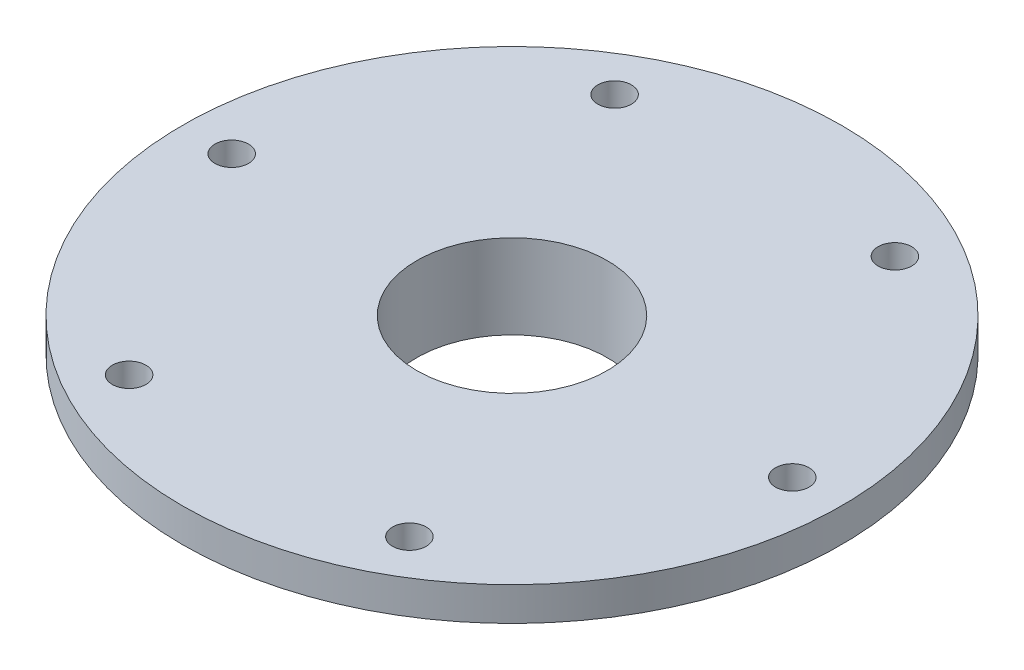
ISO-10303-21;
HEADER;
FILE_DESCRIPTION(('STEP AP214'),'2;1');
FILE_NAME('part.step','',(''),(''),'','','');
FILE_SCHEMA(('AUTOMOTIVE_DESIGN { 1 0 10303 214 1 1 1 1 }'));
ENDSEC;
DATA;
#1=APPLICATION_CONTEXT('core data for automotive mechanical design processes');
#2=APPLICATION_PROTOCOL_DEFINITION('international standard','automotive_design',2000,#1);
#3=PRODUCT_CONTEXT('',#1,'mechanical');
#4=PRODUCT('Part','Part','',(#3));
#5=PRODUCT_RELATED_PRODUCT_CATEGORY('part','',(#4));
#6=PRODUCT_DEFINITION_FORMATION('','',#4);
#7=PRODUCT_DEFINITION_CONTEXT('part definition',#1,'design');
#8=PRODUCT_DEFINITION('design','',#6,#7);
#9=PRODUCT_DEFINITION_SHAPE('','',#8);
#10=(LENGTH_UNIT() NAMED_UNIT(*) SI_UNIT(.MILLI.,.METRE.));
#11=(NAMED_UNIT(*) PLANE_ANGLE_UNIT() SI_UNIT($,.RADIAN.));
#12=(NAMED_UNIT(*) SI_UNIT($,.STERADIAN.) SOLID_ANGLE_UNIT());
#13=UNCERTAINTY_MEASURE_WITH_UNIT(LENGTH_MEASURE(1.E-05),#10,'distance_accuracy_value','');
#14=(GEOMETRIC_REPRESENTATION_CONTEXT(3) GLOBAL_UNCERTAINTY_ASSIGNED_CONTEXT((#13)) GLOBAL_UNIT_ASSIGNED_CONTEXT((#10,
#11,#12)) REPRESENTATION_CONTEXT('',''));
#15=CARTESIAN_POINT('',(0.,0.,0.));
#16=DIRECTION('',(0.,0.,1.));
#17=DIRECTION('',(1.,0.,0.));
#18=AXIS2_PLACEMENT_3D('',#15,#16,#17);
#19=CARTESIAN_POINT('',(0.,27.2792430533376,0.));
#20=DIRECTION('',(0.,1.,0.));
#21=DIRECTION('',(0.,0.,1.));
#22=AXIS2_PLACEMENT_3D('',#19,#20,#21);
#23=CYLINDRICAL_SURFACE('',#22,8.5);
#24=CARTESIAN_POINT('',(0.,0.,0.));
#25=DIRECTION('',(0.,1.,0.));
#26=DIRECTION('',(0.,0.,1.));
#27=AXIS2_PLACEMENT_3D('',#24,#25,#26);
#28=CIRCLE('',#27,8.5);
#29=CARTESIAN_POINT('',(0.,0.,8.5));
#30=VERTEX_POINT('',#29);
#31=EDGE_CURVE('E10',#30,#30,#28,.T.);
#32=ORIENTED_EDGE('',*,*,#31,.T.);
#33=EDGE_LOOP('',(#32));
#34=FACE_BOUND('',#33,.T.);
#35=CARTESIAN_POINT('',(0.,-7.5,0.));
#36=DIRECTION('',(0.,1.,0.));
#37=DIRECTION('',(0.,0.,1.));
#38=AXIS2_PLACEMENT_3D('',#35,#36,#37);
#39=CIRCLE('',#38,8.49999999999999);
#40=CARTESIAN_POINT('',(0.,-7.5,8.49999999999999));
#41=VERTEX_POINT('',#40);
#42=EDGE_CURVE('E70',#41,#41,#39,.T.);
#43=ORIENTED_EDGE('',*,*,#42,.F.);
#44=EDGE_LOOP('',(#43));
#45=FACE_BOUND('',#44,.T.);
#46=ADVANCED_FACE('F37',(#34,#45),#23,.F.);
#47=CARTESIAN_POINT('',(-8.5,0.,0.));
#48=DIRECTION('',(0.,1.,0.));
#49=DIRECTION('',(0.,0.,1.));
#50=AXIS2_PLACEMENT_3D('',#47,#48,#49);
#51=PLANE('',#50);
#52=CARTESIAN_POINT('',(-25.,0.,0.));
#53=DIRECTION('',(0.,1.,0.));
#54=DIRECTION('',(0.,0.,1.));
#55=AXIS2_PLACEMENT_3D('',#52,#53,#54);
#56=CIRCLE('',#55,1.5);
#57=CARTESIAN_POINT('',(-25.,0.,1.5));
#58=VERTEX_POINT('',#57);
#59=EDGE_CURVE('E57',#58,#58,#56,.T.);
#60=ORIENTED_EDGE('',*,*,#59,.F.);
#61=EDGE_LOOP('',(#60));
#62=FACE_BOUND('',#61,.T.);
#63=CARTESIAN_POINT('',(-12.5,0.,21.650635094611));
#64=DIRECTION('',(0.,1.,0.));
#65=DIRECTION('',(0.,0.,1.));
#66=AXIS2_PLACEMENT_3D('',#63,#64,#65);
#67=CIRCLE('',#66,1.5);
#68=CARTESIAN_POINT('',(-12.5,0.,23.150635094611));
#69=VERTEX_POINT('',#68);
#70=EDGE_CURVE('E121',#69,#69,#67,.T.);
#71=ORIENTED_EDGE('',*,*,#70,.F.);
#72=EDGE_LOOP('',(#71));
#73=FACE_BOUND('',#72,.T.);
#74=CARTESIAN_POINT('',(12.5,0.,21.650635094611));
#75=DIRECTION('',(0.,1.,0.));
#76=DIRECTION('',(0.,0.,1.));
#77=AXIS2_PLACEMENT_3D('',#74,#75,#76);
#78=CIRCLE('',#77,1.5);
#79=CARTESIAN_POINT('',(12.5,0.,23.150635094611));
#80=VERTEX_POINT('',#79);
#81=EDGE_CURVE('E82',#80,#80,#78,.T.);
#82=ORIENTED_EDGE('',*,*,#81,.F.);
#83=EDGE_LOOP('',(#82));
#84=FACE_BOUND('',#83,.T.);
#85=CARTESIAN_POINT('',(25.,0.,0.));
#86=DIRECTION('',(0.,1.,0.));
#87=DIRECTION('',(0.,0.,1.));
#88=AXIS2_PLACEMENT_3D('',#85,#86,#87);
#89=CIRCLE('',#88,1.5);
#90=CARTESIAN_POINT('',(25.,0.,1.5));
#91=VERTEX_POINT('',#90);
#92=EDGE_CURVE('E128',#91,#91,#89,.T.);
#93=ORIENTED_EDGE('',*,*,#92,.F.);
#94=EDGE_LOOP('',(#93));
#95=FACE_BOUND('',#94,.T.);
#96=CARTESIAN_POINT('',(12.5,0.,-21.650635094611));
#97=DIRECTION('',(0.,1.,0.));
#98=DIRECTION('',(0.,0.,1.));
#99=AXIS2_PLACEMENT_3D('',#96,#97,#98);
#100=CIRCLE('',#99,1.5);
#101=CARTESIAN_POINT('',(12.5,0.,-20.150635094611));
#102=VERTEX_POINT('',#101);
#103=EDGE_CURVE('E132',#102,#102,#100,.T.);
#104=ORIENTED_EDGE('',*,*,#103,.F.);
#105=EDGE_LOOP('',(#104));
#106=FACE_BOUND('',#105,.T.);
#107=CARTESIAN_POINT('',(-12.5,0.,-21.650635094611));
#108=DIRECTION('',(0.,1.,0.));
#109=DIRECTION('',(0.,0.,1.));
#110=AXIS2_PLACEMENT_3D('',#107,#108,#109);
#111=CIRCLE('',#110,1.5);
#112=CARTESIAN_POINT('',(-12.5,0.,-20.150635094611));
#113=VERTEX_POINT('',#112);
#114=EDGE_CURVE('E136',#113,#113,#111,.T.);
#115=ORIENTED_EDGE('',*,*,#114,.F.);
#116=EDGE_LOOP('',(#115));
#117=FACE_BOUND('',#116,.T.);
#118=CARTESIAN_POINT('',(0.,0.,0.));
#119=DIRECTION('',(0.,1.,0.));
#120=DIRECTION('',(0.,0.,1.));
#121=AXIS2_PLACEMENT_3D('',#118,#119,#120);
#122=CIRCLE('',#121,29.39375);
#123=CARTESIAN_POINT('',(0.,0.,29.39375));
#124=VERTEX_POINT('',#123);
#125=EDGE_CURVE('E44',#124,#124,#122,.T.);
#126=ORIENTED_EDGE('',*,*,#125,.T.);
#127=EDGE_LOOP('',(#126));
#128=FACE_BOUND('',#127,.T.);
#129=ORIENTED_EDGE('',*,*,#31,.F.);
#130=EDGE_LOOP('',(#129));
#131=FACE_BOUND('',#130,.T.);
#132=ADVANCED_FACE('F104',(#62,#73,#84,#95,#106,#117,#128,#131),#51,.T.);
#133=CARTESIAN_POINT('',(0.,27.2792430533376,0.));
#134=DIRECTION('',(0.,1.,0.));
#135=DIRECTION('',(0.,0.,1.));
#136=AXIS2_PLACEMENT_3D('',#133,#134,#135);
#137=CYLINDRICAL_SURFACE('',#136,29.39375);
#138=CARTESIAN_POINT('',(0.,-3.,0.));
#139=DIRECTION('',(0.,1.,0.));
#140=DIRECTION('',(0.,0.,1.));
#141=AXIS2_PLACEMENT_3D('',#138,#139,#140);
#142=CIRCLE('',#141,29.39375);
#143=CARTESIAN_POINT('',(0.,-3.,29.39375));
#144=VERTEX_POINT('',#143);
#145=EDGE_CURVE('E49',#144,#144,#142,.T.);
#146=ORIENTED_EDGE('',*,*,#145,.T.);
#147=EDGE_LOOP('',(#146));
#148=FACE_BOUND('',#147,.T.);
#149=ORIENTED_EDGE('',*,*,#125,.F.);
#150=EDGE_LOOP('',(#149));
#151=FACE_BOUND('',#150,.T.);
#152=ADVANCED_FACE('F89',(#148,#151),#137,.T.);
#153=CARTESIAN_POINT('',(-29.39375,-3.,0.));
#154=DIRECTION('',(0.,-1.,0.));
#155=DIRECTION('',(0.,0.,-1.));
#156=AXIS2_PLACEMENT_3D('',#153,#154,#155);
#157=PLANE('',#156);
#158=CARTESIAN_POINT('',(-25.,-3.,0.));
#159=DIRECTION('',(0.,-1.,0.));
#160=DIRECTION('',(0.,0.,-1.));
#161=AXIS2_PLACEMENT_3D('',#158,#159,#160);
#162=CIRCLE('',#161,1.5);
#163=CARTESIAN_POINT('',(-25.,-3.,-1.5));
#164=VERTEX_POINT('',#163);
#165=EDGE_CURVE('E40',#164,#164,#162,.T.);
#166=ORIENTED_EDGE('',*,*,#165,.F.);
#167=EDGE_LOOP('',(#166));
#168=FACE_BOUND('',#167,.T.);
#169=CARTESIAN_POINT('',(-12.5,-3.,21.650635094611));
#170=DIRECTION('',(0.,-1.,0.));
#171=DIRECTION('',(0.,0.,-1.));
#172=AXIS2_PLACEMENT_3D('',#169,#170,#171);
#173=CIRCLE('',#172,1.5);
#174=CARTESIAN_POINT('',(-12.5,-3.,20.150635094611));
#175=VERTEX_POINT('',#174);
#176=EDGE_CURVE('E65',#175,#175,#173,.T.);
#177=ORIENTED_EDGE('',*,*,#176,.F.);
#178=EDGE_LOOP('',(#177));
#179=FACE_BOUND('',#178,.T.);
#180=CARTESIAN_POINT('',(12.5,-3.,21.650635094611));
#181=DIRECTION('',(0.,-1.,0.));
#182=DIRECTION('',(0.,0.,-1.));
#183=AXIS2_PLACEMENT_3D('',#180,#181,#182);
#184=CIRCLE('',#183,1.5);
#185=CARTESIAN_POINT('',(12.5,-3.,20.150635094611));
#186=VERTEX_POINT('',#185);
#187=EDGE_CURVE('E63',#186,#186,#184,.T.);
#188=ORIENTED_EDGE('',*,*,#187,.F.);
#189=EDGE_LOOP('',(#188));
#190=FACE_BOUND('',#189,.T.);
#191=CARTESIAN_POINT('',(25.,-3.,0.));
#192=DIRECTION('',(0.,-1.,0.));
#193=DIRECTION('',(0.,0.,-1.));
#194=AXIS2_PLACEMENT_3D('',#191,#192,#193);
#195=CIRCLE('',#194,1.5);
#196=CARTESIAN_POINT('',(25.,-3.,-1.5));
#197=VERTEX_POINT('',#196);
#198=EDGE_CURVE('E60',#197,#197,#195,.T.);
#199=ORIENTED_EDGE('',*,*,#198,.F.);
#200=EDGE_LOOP('',(#199));
#201=FACE_BOUND('',#200,.T.);
#202=CARTESIAN_POINT('',(12.5,-3.,-21.650635094611));
#203=DIRECTION('',(0.,-1.,0.));
#204=DIRECTION('',(0.,0.,-1.));
#205=AXIS2_PLACEMENT_3D('',#202,#203,#204);
#206=CIRCLE('',#205,1.5);
#207=CARTESIAN_POINT('',(12.5,-3.,-23.150635094611));
#208=VERTEX_POINT('',#207);
#209=EDGE_CURVE('E56',#208,#208,#206,.T.);
#210=ORIENTED_EDGE('',*,*,#209,.F.);
#211=EDGE_LOOP('',(#210));
#212=FACE_BOUND('',#211,.T.);
#213=CARTESIAN_POINT('',(-12.5,-3.,-21.650635094611));
#214=DIRECTION('',(0.,-1.,0.));
#215=DIRECTION('',(0.,0.,-1.));
#216=AXIS2_PLACEMENT_3D('',#213,#214,#215);
#217=CIRCLE('',#216,1.5);
#218=CARTESIAN_POINT('',(-12.5,-3.,-23.150635094611));
#219=VERTEX_POINT('',#218);
#220=EDGE_CURVE('E53',#219,#219,#217,.T.);
#221=ORIENTED_EDGE('',*,*,#220,.F.);
#222=EDGE_LOOP('',(#221));
#223=FACE_BOUND('',#222,.T.);
#224=CARTESIAN_POINT('',(0.,-3.,0.));
#225=DIRECTION('',(0.,1.,0.));
#226=DIRECTION('',(0.,0.,1.));
#227=AXIS2_PLACEMENT_3D('',#224,#225,#226);
#228=CIRCLE('',#227,11.75);
#229=CARTESIAN_POINT('',(0.,-3.,11.75));
#230=VERTEX_POINT('',#229);
#231=EDGE_CURVE('E79',#230,#230,#228,.T.);
#232=ORIENTED_EDGE('',*,*,#231,.T.);
#233=EDGE_LOOP('',(#232));
#234=FACE_BOUND('',#233,.T.);
#235=ORIENTED_EDGE('',*,*,#145,.F.);
#236=EDGE_LOOP('',(#235));
#237=FACE_BOUND('',#236,.T.);
#238=ADVANCED_FACE('F92',(#168,#179,#190,#201,#212,#223,#234,#237),#157,.T.);
#239=CARTESIAN_POINT('',(0.,27.2792430533376,0.));
#240=DIRECTION('',(0.,1.,0.));
#241=DIRECTION('',(0.,0.,1.));
#242=AXIS2_PLACEMENT_3D('',#239,#240,#241);
#243=CYLINDRICAL_SURFACE('',#242,11.75);
#244=CARTESIAN_POINT('',(0.,-7.5,0.));
#245=DIRECTION('',(0.,1.,0.));
#246=DIRECTION('',(0.,0.,1.));
#247=AXIS2_PLACEMENT_3D('',#244,#245,#246);
#248=CIRCLE('',#247,11.75);
#249=CARTESIAN_POINT('',(0.,-7.5,11.75));
#250=VERTEX_POINT('',#249);
#251=EDGE_CURVE('E74',#250,#250,#248,.T.);
#252=ORIENTED_EDGE('',*,*,#251,.T.);
#253=EDGE_LOOP('',(#252));
#254=FACE_BOUND('',#253,.T.);
#255=ORIENTED_EDGE('',*,*,#231,.F.);
#256=EDGE_LOOP('',(#255));
#257=FACE_BOUND('',#256,.T.);
#258=ADVANCED_FACE('F94',(#254,#257),#243,.T.);
#259=CARTESIAN_POINT('',(-11.75,-7.5,0.));
#260=DIRECTION('',(0.,-1.,0.));
#261=DIRECTION('',(0.,0.,-1.));
#262=AXIS2_PLACEMENT_3D('',#259,#260,#261);
#263=PLANE('',#262);
#264=ORIENTED_EDGE('',*,*,#42,.T.);
#265=EDGE_LOOP('',(#264));
#266=FACE_BOUND('',#265,.T.);
#267=ORIENTED_EDGE('',*,*,#251,.F.);
#268=EDGE_LOOP('',(#267));
#269=FACE_BOUND('',#268,.T.);
#270=ADVANCED_FACE('F101',(#266,#269),#263,.T.);
#271=CARTESIAN_POINT('',(-12.5,-7.5,-21.650635094611));
#272=DIRECTION('',(0.,1.,0.));
#273=DIRECTION('',(0.,0.,1.));
#274=AXIS2_PLACEMENT_3D('',#271,#272,#273);
#275=CYLINDRICAL_SURFACE('',#274,1.5);
#276=ORIENTED_EDGE('',*,*,#220,.T.);
#277=EDGE_LOOP('',(#276));
#278=FACE_BOUND('',#277,.T.);
#279=ORIENTED_EDGE('',*,*,#114,.T.);
#280=EDGE_LOOP('',(#279));
#281=FACE_BOUND('',#280,.T.);
#282=ADVANCED_FACE('F161',(#278,#281),#275,.F.);
#283=CARTESIAN_POINT('',(12.5,-7.5,-21.650635094611));
#284=DIRECTION('',(0.,1.,0.));
#285=DIRECTION('',(0.,0.,1.));
#286=AXIS2_PLACEMENT_3D('',#283,#284,#285);
#287=CYLINDRICAL_SURFACE('',#286,1.5);
#288=ORIENTED_EDGE('',*,*,#209,.T.);
#289=EDGE_LOOP('',(#288));
#290=FACE_BOUND('',#289,.T.);
#291=ORIENTED_EDGE('',*,*,#103,.T.);
#292=EDGE_LOOP('',(#291));
#293=FACE_BOUND('',#292,.T.);
#294=ADVANCED_FACE('F164',(#290,#293),#287,.F.);
#295=CARTESIAN_POINT('',(25.,-7.5,0.));
#296=DIRECTION('',(0.,1.,0.));
#297=DIRECTION('',(0.,0.,1.));
#298=AXIS2_PLACEMENT_3D('',#295,#296,#297);
#299=CYLINDRICAL_SURFACE('',#298,1.5);
#300=ORIENTED_EDGE('',*,*,#198,.T.);
#301=EDGE_LOOP('',(#300));
#302=FACE_BOUND('',#301,.T.);
#303=ORIENTED_EDGE('',*,*,#92,.T.);
#304=EDGE_LOOP('',(#303));
#305=FACE_BOUND('',#304,.T.);
#306=ADVANCED_FACE('F157',(#302,#305),#299,.F.);
#307=CARTESIAN_POINT('',(12.5,-7.5,21.650635094611));
#308=DIRECTION('',(0.,1.,0.));
#309=DIRECTION('',(0.,0.,1.));
#310=AXIS2_PLACEMENT_3D('',#307,#308,#309);
#311=CYLINDRICAL_SURFACE('',#310,1.5);
#312=ORIENTED_EDGE('',*,*,#187,.T.);
#313=EDGE_LOOP('',(#312));
#314=FACE_BOUND('',#313,.T.);
#315=ORIENTED_EDGE('',*,*,#81,.T.);
#316=EDGE_LOOP('',(#315));
#317=FACE_BOUND('',#316,.T.);
#318=ADVANCED_FACE('F150',(#314,#317),#311,.F.);
#319=CARTESIAN_POINT('',(-12.5,-7.5,21.650635094611));
#320=DIRECTION('',(0.,1.,0.));
#321=DIRECTION('',(0.,0.,1.));
#322=AXIS2_PLACEMENT_3D('',#319,#320,#321);
#323=CYLINDRICAL_SURFACE('',#322,1.5);
#324=ORIENTED_EDGE('',*,*,#176,.T.);
#325=EDGE_LOOP('',(#324));
#326=FACE_BOUND('',#325,.T.);
#327=ORIENTED_EDGE('',*,*,#70,.T.);
#328=EDGE_LOOP('',(#327));
#329=FACE_BOUND('',#328,.T.);
#330=ADVANCED_FACE('F147',(#326,#329),#323,.F.);
#331=CARTESIAN_POINT('',(-25.,-7.5,0.));
#332=DIRECTION('',(0.,1.,0.));
#333=DIRECTION('',(0.,0.,1.));
#334=AXIS2_PLACEMENT_3D('',#331,#332,#333);
#335=CYLINDRICAL_SURFACE('',#334,1.5);
#336=ORIENTED_EDGE('',*,*,#165,.T.);
#337=EDGE_LOOP('',(#336));
#338=FACE_BOUND('',#337,.T.);
#339=ORIENTED_EDGE('',*,*,#59,.T.);
#340=EDGE_LOOP('',(#339));
#341=FACE_BOUND('',#340,.T.);
#342=ADVANCED_FACE('F149',(#338,#341),#335,.F.);
#343=CLOSED_SHELL('',(#46,#132,#152,#238,#258,#270,#282,#294,#306,#318,#330,#342));
#344=MANIFOLD_SOLID_BREP('B2',#343);
#345=ADVANCED_BREP_SHAPE_REPRESENTATION('',(#18,#344),#14);
#346=SHAPE_DEFINITION_REPRESENTATION(#9,#345);
ENDSEC;
END-ISO-10303-21;
